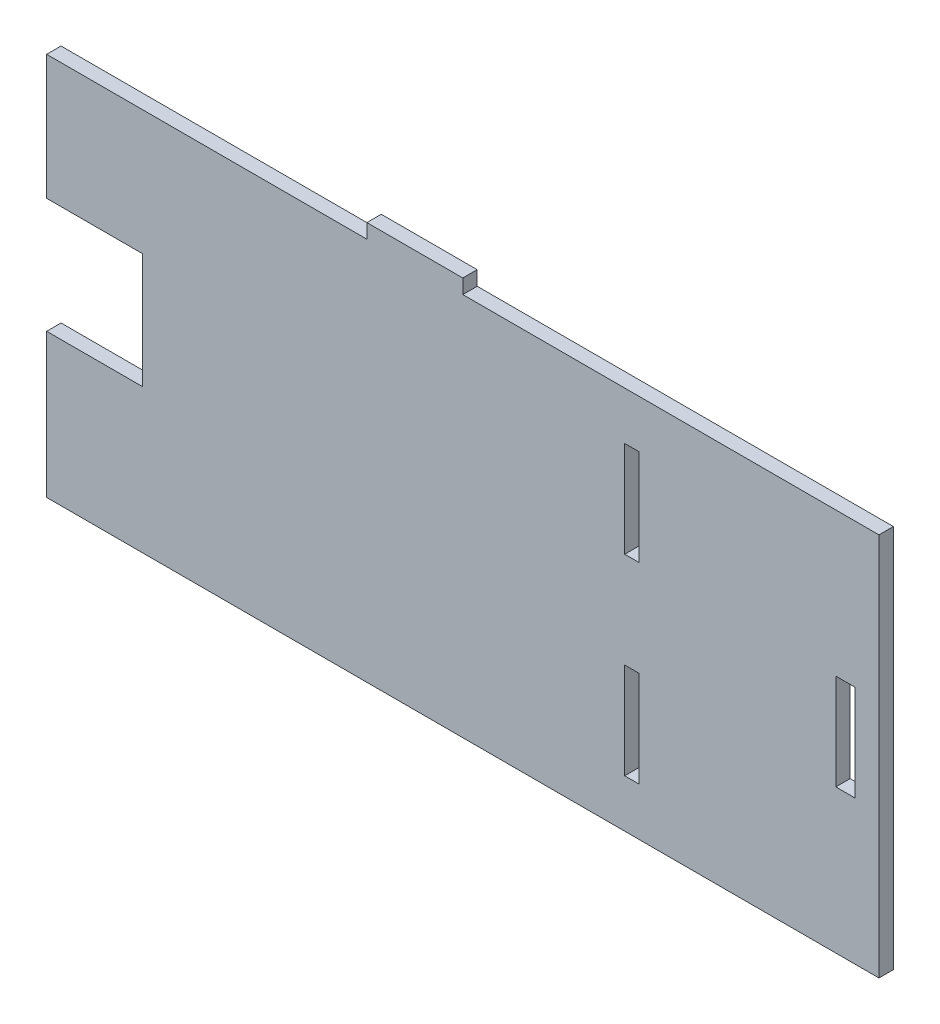
ISO-10303-21;
HEADER;
FILE_DESCRIPTION(('STEP AP214'),'2;1');
FILE_NAME('part.step','',(''),(''),'','','');
FILE_SCHEMA(('AUTOMOTIVE_DESIGN { 1 0 10303 214 1 1 1 1 }'));
ENDSEC;
DATA;
#1=APPLICATION_CONTEXT('core data for automotive mechanical design processes');
#2=APPLICATION_PROTOCOL_DEFINITION('international standard','automotive_design',2000,#1);
#3=PRODUCT_CONTEXT('',#1,'mechanical');
#4=PRODUCT('Part','Part','',(#3));
#5=PRODUCT_RELATED_PRODUCT_CATEGORY('part','',(#4));
#6=PRODUCT_DEFINITION_FORMATION('','',#4);
#7=PRODUCT_DEFINITION_CONTEXT('part definition',#1,'design');
#8=PRODUCT_DEFINITION('design','',#6,#7);
#9=PRODUCT_DEFINITION_SHAPE('','',#8);
#10=(LENGTH_UNIT() NAMED_UNIT(*) SI_UNIT(.MILLI.,.METRE.));
#11=(NAMED_UNIT(*) PLANE_ANGLE_UNIT() SI_UNIT($,.RADIAN.));
#12=(NAMED_UNIT(*) SI_UNIT($,.STERADIAN.) SOLID_ANGLE_UNIT());
#13=UNCERTAINTY_MEASURE_WITH_UNIT(LENGTH_MEASURE(1.E-05),#10,'distance_accuracy_value','');
#14=(GEOMETRIC_REPRESENTATION_CONTEXT(3) GLOBAL_UNCERTAINTY_ASSIGNED_CONTEXT((#13)) GLOBAL_UNIT_ASSIGNED_CONTEXT((#10,
#11,#12)) REPRESENTATION_CONTEXT('',''));
#15=CARTESIAN_POINT('',(0.,0.,0.));
#16=DIRECTION('',(0.,0.,1.));
#17=DIRECTION('',(1.,0.,0.));
#18=AXIS2_PLACEMENT_3D('',#15,#16,#17);
#19=CARTESIAN_POINT('',(-173.5,0.,3.));
#20=DIRECTION('',(1.,0.,0.));
#21=DIRECTION('',(0.,0.,-1.));
#22=AXIS2_PLACEMENT_3D('',#19,#20,#21);
#23=PLANE('',#22);
#24=DIRECTION('',(0.,-1.,0.));
#25=VECTOR('',#24,1.);
#26=CARTESIAN_POINT('',(-173.5,0.,0.));
#27=LINE('',#26,#25);
#28=CARTESIAN_POINT('',(-173.5,0.,0.));
#29=VERTEX_POINT('',#28);
#30=CARTESIAN_POINT('',(-173.5,-26.,0.));
#31=VERTEX_POINT('',#30);
#32=EDGE_CURVE('E241',#29,#31,#27,.T.);
#33=ORIENTED_EDGE('',*,*,#32,.T.);
#34=DIRECTION('',(0.,0.,1.));
#35=VECTOR('',#34,1.);
#36=CARTESIAN_POINT('',(-173.5,-26.,-7.));
#37=LINE('',#36,#35);
#38=CARTESIAN_POINT('',(-173.5,-26.,3.));
#39=VERTEX_POINT('',#38);
#40=EDGE_CURVE('E457',#31,#39,#37,.T.);
#41=ORIENTED_EDGE('',*,*,#40,.T.);
#42=DIRECTION('',(0.,-1.,0.));
#43=VECTOR('',#42,1.);
#44=CARTESIAN_POINT('',(-173.5,0.,3.));
#45=LINE('',#44,#43);
#46=CARTESIAN_POINT('',(-173.5,0.,3.));
#47=VERTEX_POINT('',#46);
#48=EDGE_CURVE('E222',#47,#39,#45,.T.);
#49=ORIENTED_EDGE('',*,*,#48,.F.);
#50=DIRECTION('',(0.,0.,-1.));
#51=VECTOR('',#50,1.);
#52=CARTESIAN_POINT('',(-173.5,0.,3.));
#53=LINE('',#52,#51);
#54=EDGE_CURVE('E250',#47,#29,#53,.T.);
#55=ORIENTED_EDGE('',*,*,#54,.T.);
#56=EDGE_LOOP('',(#33,#41,#49,#55));
#57=FACE_BOUND('',#56,.T.);
#58=ADVANCED_FACE('F39',(#57),#23,.F.);
#59=CARTESIAN_POINT('',(0.,0.,3.));
#60=DIRECTION('',(0.,-1.,0.));
#61=DIRECTION('',(1.,0.,0.));
#62=AXIS2_PLACEMENT_3D('',#59,#60,#61);
#63=PLANE('',#62);
#64=DIRECTION('',(0.,0.,-1.));
#65=VECTOR('',#64,1.);
#66=CARTESIAN_POINT('',(-86.75,0.,3.));
#67=LINE('',#66,#65);
#68=CARTESIAN_POINT('',(-86.75,0.,3.));
#69=VERTEX_POINT('',#68);
#70=CARTESIAN_POINT('',(-86.75,0.,0.));
#71=VERTEX_POINT('',#70);
#72=EDGE_CURVE('E280',#69,#71,#67,.T.);
#73=ORIENTED_EDGE('',*,*,#72,.F.);
#74=DIRECTION('',(-1.,0.,0.));
#75=VECTOR('',#74,1.);
#76=CARTESIAN_POINT('',(0.,0.,3.));
#77=LINE('',#76,#75);
#78=CARTESIAN_POINT('',(0.,0.,3.));
#79=VERTEX_POINT('',#78);
#80=EDGE_CURVE('E223',#79,#69,#77,.T.);
#81=ORIENTED_EDGE('',*,*,#80,.F.);
#82=DIRECTION('',(0.,0.,-1.));
#83=VECTOR('',#82,1.);
#84=CARTESIAN_POINT('',(0.,0.,3.));
#85=LINE('',#84,#83);
#86=CARTESIAN_POINT('',(0.,0.,0.));
#87=VERTEX_POINT('',#86);
#88=EDGE_CURVE('E253',#79,#87,#85,.T.);
#89=ORIENTED_EDGE('',*,*,#88,.T.);
#90=DIRECTION('',(-1.,0.,0.));
#91=VECTOR('',#90,1.);
#92=CARTESIAN_POINT('',(0.,0.,0.));
#93=LINE('',#92,#91);
#94=EDGE_CURVE('E238',#87,#71,#93,.T.);
#95=ORIENTED_EDGE('',*,*,#94,.T.);
#96=EDGE_LOOP('',(#73,#81,#89,#95));
#97=FACE_BOUND('',#96,.T.);
#98=ADVANCED_FACE('F277',(#97),#63,.F.);
#99=DIRECTION('',(0.,0.,1.));
#100=VECTOR('',#99,1.);
#101=CARTESIAN_POINT('',(-106.75,0.,3.));
#102=LINE('',#101,#100);
#103=CARTESIAN_POINT('',(-106.75,0.,0.));
#104=VERTEX_POINT('',#103);
#105=CARTESIAN_POINT('',(-106.75,0.,3.));
#106=VERTEX_POINT('',#105);
#107=EDGE_CURVE('E283',#104,#106,#102,.T.);
#108=ORIENTED_EDGE('',*,*,#107,.F.);
#109=EDGE_CURVE('E236',#104,#29,#93,.T.);
#110=ORIENTED_EDGE('',*,*,#109,.T.);
#111=ORIENTED_EDGE('',*,*,#54,.F.);
#112=EDGE_CURVE('E227',#106,#47,#77,.T.);
#113=ORIENTED_EDGE('',*,*,#112,.F.);
#114=EDGE_LOOP('',(#108,#110,#111,#113));
#115=FACE_BOUND('',#114,.T.);
#116=ADVANCED_FACE('F406',(#115),#63,.F.);
#117=CARTESIAN_POINT('',(0.,0.,3.));
#118=DIRECTION('',(-1.,0.,0.));
#119=DIRECTION('',(0.,0.,1.));
#120=AXIS2_PLACEMENT_3D('',#117,#118,#119);
#121=PLANE('',#120);
#122=DIRECTION('',(0.,1.,0.));
#123=VECTOR('',#122,1.);
#124=CARTESIAN_POINT('',(0.,0.,0.));
#125=LINE('',#124,#123);
#126=CARTESIAN_POINT('',(0.,-80.,0.));
#127=VERTEX_POINT('',#126);
#128=EDGE_CURVE('E233',#127,#87,#125,.T.);
#129=ORIENTED_EDGE('',*,*,#128,.T.);
#130=ORIENTED_EDGE('',*,*,#88,.F.);
#131=DIRECTION('',(0.,1.,0.));
#132=VECTOR('',#131,1.);
#133=CARTESIAN_POINT('',(0.,0.,3.));
#134=LINE('',#133,#132);
#135=CARTESIAN_POINT('',(0.,-80.,3.));
#136=VERTEX_POINT('',#135);
#137=EDGE_CURVE('E246',#136,#79,#134,.T.);
#138=ORIENTED_EDGE('',*,*,#137,.F.);
#139=DIRECTION('',(0.,0.,-1.));
#140=VECTOR('',#139,1.);
#141=CARTESIAN_POINT('',(0.,-80.,3.));
#142=LINE('',#141,#140);
#143=EDGE_CURVE('E232',#136,#127,#142,.T.);
#144=ORIENTED_EDGE('',*,*,#143,.T.);
#145=EDGE_LOOP('',(#129,#130,#138,#144));
#146=FACE_BOUND('',#145,.T.);
#147=ADVANCED_FACE('F41',(#146),#121,.F.);
#148=CARTESIAN_POINT('',(-173.5,-50.,3.));
#149=VERTEX_POINT('',#148);
#150=CARTESIAN_POINT('',(-173.5,-80.,3.));
#151=VERTEX_POINT('',#150);
#152=EDGE_CURVE('E212',#149,#151,#45,.T.);
#153=ORIENTED_EDGE('',*,*,#152,.F.);
#154=DIRECTION('',(0.,0.,1.));
#155=VECTOR('',#154,1.);
#156=CARTESIAN_POINT('',(-173.5,-50.,-7.));
#157=LINE('',#156,#155);
#158=CARTESIAN_POINT('',(-173.5,-50.,0.));
#159=VERTEX_POINT('',#158);
#160=EDGE_CURVE('E197',#159,#149,#157,.T.);
#161=ORIENTED_EDGE('',*,*,#160,.F.);
#162=CARTESIAN_POINT('',(-173.5,-80.,0.));
#163=VERTEX_POINT('',#162);
#164=EDGE_CURVE('E240',#159,#163,#27,.T.);
#165=ORIENTED_EDGE('',*,*,#164,.T.);
#166=DIRECTION('',(0.,0.,-1.));
#167=VECTOR('',#166,1.);
#168=CARTESIAN_POINT('',(-173.5,-80.,3.));
#169=LINE('',#168,#167);
#170=EDGE_CURVE('E220',#151,#163,#169,.T.);
#171=ORIENTED_EDGE('',*,*,#170,.F.);
#172=EDGE_LOOP('',(#153,#161,#165,#171));
#173=FACE_BOUND('',#172,.T.);
#174=ADVANCED_FACE('F218',(#173),#23,.F.);
#175=CARTESIAN_POINT('',(0.,-80.,3.));
#176=DIRECTION('',(0.,1.,0.));
#177=DIRECTION('',(-1.,0.,0.));
#178=AXIS2_PLACEMENT_3D('',#175,#176,#177);
#179=PLANE('',#178);
#180=DIRECTION('',(1.,0.,0.));
#181=VECTOR('',#180,1.);
#182=CARTESIAN_POINT('',(0.,-80.,0.));
#183=LINE('',#182,#181);
#184=EDGE_CURVE('E244',#163,#127,#183,.T.);
#185=ORIENTED_EDGE('',*,*,#184,.T.);
#186=ORIENTED_EDGE('',*,*,#143,.F.);
#187=DIRECTION('',(1.,0.,0.));
#188=VECTOR('',#187,1.);
#189=CARTESIAN_POINT('',(0.,-80.,3.));
#190=LINE('',#189,#188);
#191=EDGE_CURVE('E225',#151,#136,#190,.T.);
#192=ORIENTED_EDGE('',*,*,#191,.F.);
#193=ORIENTED_EDGE('',*,*,#170,.T.);
#194=EDGE_LOOP('',(#185,#186,#192,#193));
#195=FACE_BOUND('',#194,.T.);
#196=ADVANCED_FACE('F268',(#195),#179,.F.);
#197=CARTESIAN_POINT('',(0.,0.,3.));
#198=DIRECTION('',(0.,0.,-1.));
#199=DIRECTION('',(-1.,0.,0.));
#200=AXIS2_PLACEMENT_3D('',#197,#198,#199);
#201=PLANE('',#200);
#202=DIRECTION('',(1.,0.,0.));
#203=VECTOR('',#202,1.);
#204=CARTESIAN_POINT('',(0.,-30.,3.));
#205=LINE('',#204,#203);
#206=CARTESIAN_POINT('',(-9.,-30.,3.));
#207=VERTEX_POINT('',#206);
#208=CARTESIAN_POINT('',(-5.,-30.,3.));
#209=VERTEX_POINT('',#208);
#210=EDGE_CURVE('E290',#207,#209,#205,.T.);
#211=ORIENTED_EDGE('',*,*,#210,.T.);
#212=DIRECTION('',(0.,-1.,0.));
#213=VECTOR('',#212,1.);
#214=CARTESIAN_POINT('',(-5.,0.,3.));
#215=LINE('',#214,#213);
#216=CARTESIAN_POINT('',(-5.,-50.,3.));
#217=VERTEX_POINT('',#216);
#218=EDGE_CURVE('E284',#209,#217,#215,.T.);
#219=ORIENTED_EDGE('',*,*,#218,.T.);
#220=DIRECTION('',(-1.,0.,0.));
#221=VECTOR('',#220,1.);
#222=CARTESIAN_POINT('',(0.,-50.,3.));
#223=LINE('',#222,#221);
#224=CARTESIAN_POINT('',(-9.00000000000001,-50.,3.));
#225=VERTEX_POINT('',#224);
#226=EDGE_CURVE('E437',#217,#225,#223,.T.);
#227=ORIENTED_EDGE('',*,*,#226,.T.);
#228=DIRECTION('',(0.,1.,0.));
#229=VECTOR('',#228,1.);
#230=CARTESIAN_POINT('',(-8.99999999999999,0.,3.));
#231=LINE('',#230,#229);
#232=EDGE_CURVE('E434',#225,#207,#231,.T.);
#233=ORIENTED_EDGE('',*,*,#232,.T.);
#234=EDGE_LOOP('',(#211,#219,#227,#233));
#235=FACE_BOUND('',#234,.T.);
#236=DIRECTION('',(1.,0.,0.));
#237=VECTOR('',#236,1.);
#238=CARTESIAN_POINT('',(-53.,-30.,3.));
#239=LINE('',#238,#237);
#240=CARTESIAN_POINT('',(-53.,-30.,3.));
#241=VERTEX_POINT('',#240);
#242=CARTESIAN_POINT('',(-50.,-30.,3.));
#243=VERTEX_POINT('',#242);
#244=EDGE_CURVE('E319',#241,#243,#239,.T.);
#245=ORIENTED_EDGE('',*,*,#244,.F.);
#246=DIRECTION('',(0.,-1.,0.));
#247=VECTOR('',#246,1.);
#248=CARTESIAN_POINT('',(-53.,-30.,3.));
#249=LINE('',#248,#247);
#250=CARTESIAN_POINT('',(-53.,-10.,3.));
#251=VERTEX_POINT('',#250);
#252=EDGE_CURVE('E317',#251,#241,#249,.T.);
#253=ORIENTED_EDGE('',*,*,#252,.F.);
#254=DIRECTION('',(-1.,0.,0.));
#255=VECTOR('',#254,1.);
#256=CARTESIAN_POINT('',(-53.,-10.,3.));
#257=LINE('',#256,#255);
#258=CARTESIAN_POINT('',(-50.,-10.,3.));
#259=VERTEX_POINT('',#258);
#260=EDGE_CURVE('E325',#259,#251,#257,.T.);
#261=ORIENTED_EDGE('',*,*,#260,.F.);
#262=DIRECTION('',(0.,1.,0.));
#263=VECTOR('',#262,1.);
#264=CARTESIAN_POINT('',(-50.,-30.,3.));
#265=LINE('',#264,#263);
#266=EDGE_CURVE('E322',#243,#259,#265,.T.);
#267=ORIENTED_EDGE('',*,*,#266,.F.);
#268=EDGE_LOOP('',(#245,#253,#261,#267));
#269=FACE_BOUND('',#268,.T.);
#270=DIRECTION('',(1.,0.,0.));
#271=VECTOR('',#270,1.);
#272=CARTESIAN_POINT('',(-53.,-70.,3.));
#273=LINE('',#272,#271);
#274=CARTESIAN_POINT('',(-53.,-70.,3.));
#275=VERTEX_POINT('',#274);
#276=CARTESIAN_POINT('',(-50.,-70.,3.));
#277=VERTEX_POINT('',#276);
#278=EDGE_CURVE('E356',#275,#277,#273,.T.);
#279=ORIENTED_EDGE('',*,*,#278,.F.);
#280=DIRECTION('',(0.,-1.,0.));
#281=VECTOR('',#280,1.);
#282=CARTESIAN_POINT('',(-53.,-70.,3.));
#283=LINE('',#282,#281);
#284=CARTESIAN_POINT('',(-53.,-50.,3.));
#285=VERTEX_POINT('',#284);
#286=EDGE_CURVE('E359',#285,#275,#283,.T.);
#287=ORIENTED_EDGE('',*,*,#286,.F.);
#288=DIRECTION('',(-1.,0.,0.));
#289=VECTOR('',#288,1.);
#290=CARTESIAN_POINT('',(-53.,-50.,3.));
#291=LINE('',#290,#289);
#292=CARTESIAN_POINT('',(-50.,-50.,3.));
#293=VERTEX_POINT('',#292);
#294=EDGE_CURVE('E345',#293,#285,#291,.T.);
#295=ORIENTED_EDGE('',*,*,#294,.F.);
#296=DIRECTION('',(0.,1.,0.));
#297=VECTOR('',#296,1.);
#298=CARTESIAN_POINT('',(-50.,-70.,3.));
#299=LINE('',#298,#297);
#300=EDGE_CURVE('E353',#277,#293,#299,.T.);
#301=ORIENTED_EDGE('',*,*,#300,.F.);
#302=EDGE_LOOP('',(#279,#287,#295,#301));
#303=FACE_BOUND('',#302,.T.);
#304=ORIENTED_EDGE('',*,*,#48,.T.);
#305=DIRECTION('',(-1.,0.,0.));
#306=VECTOR('',#305,1.);
#307=CARTESIAN_POINT('',(-173.5,-26.,3.));
#308=LINE('',#307,#306);
#309=CARTESIAN_POINT('',(-153.5,-26.,3.));
#310=VERTEX_POINT('',#309);
#311=EDGE_CURVE('E207',#310,#39,#308,.T.);
#312=ORIENTED_EDGE('',*,*,#311,.F.);
#313=DIRECTION('',(0.,1.,0.));
#314=VECTOR('',#313,1.);
#315=CARTESIAN_POINT('',(-153.5,-26.,3.));
#316=LINE('',#315,#314);
#317=CARTESIAN_POINT('',(-153.5,-50.,3.));
#318=VERTEX_POINT('',#317);
#319=EDGE_CURVE('E216',#318,#310,#316,.T.);
#320=ORIENTED_EDGE('',*,*,#319,.F.);
#321=DIRECTION('',(1.,0.,0.));
#322=VECTOR('',#321,1.);
#323=CARTESIAN_POINT('',(-173.5,-50.,3.));
#324=LINE('',#323,#322);
#325=EDGE_CURVE('E200',#149,#318,#324,.T.);
#326=ORIENTED_EDGE('',*,*,#325,.F.);
#327=ORIENTED_EDGE('',*,*,#152,.T.);
#328=ORIENTED_EDGE('',*,*,#191,.T.);
#329=ORIENTED_EDGE('',*,*,#137,.T.);
#330=ORIENTED_EDGE('',*,*,#80,.T.);
#331=DIRECTION('',(0.,-1.,0.));
#332=VECTOR('',#331,1.);
#333=CARTESIAN_POINT('',(-86.75,2.99999999999999,3.));
#334=LINE('',#333,#332);
#335=CARTESIAN_POINT('',(-86.75,2.99999999999999,3.));
#336=VERTEX_POINT('',#335);
#337=EDGE_CURVE('E296',#336,#69,#334,.T.);
#338=ORIENTED_EDGE('',*,*,#337,.F.);
#339=DIRECTION('',(1.,0.,0.));
#340=VECTOR('',#339,1.);
#341=CARTESIAN_POINT('',(-86.75,2.99999999999999,3.));
#342=LINE('',#341,#340);
#343=CARTESIAN_POINT('',(-106.75,2.99999999999999,3.));
#344=VERTEX_POINT('',#343);
#345=EDGE_CURVE('E293',#344,#336,#342,.T.);
#346=ORIENTED_EDGE('',*,*,#345,.F.);
#347=DIRECTION('',(0.,-1.,0.));
#348=VECTOR('',#347,1.);
#349=CARTESIAN_POINT('',(-106.75,2.99999999999999,3.));
#350=LINE('',#349,#348);
#351=EDGE_CURVE('E298',#344,#106,#350,.T.);
#352=ORIENTED_EDGE('',*,*,#351,.T.);
#353=ORIENTED_EDGE('',*,*,#112,.T.);
#354=EDGE_LOOP('',(#304,#312,#320,#326,#327,#328,#329,#330,#338,#346,#352,#353));
#355=FACE_BOUND('',#354,.T.);
#356=ADVANCED_FACE('F211',(#235,#269,#303,#355),#201,.F.);
#357=CARTESIAN_POINT('',(0.,0.,0.));
#358=DIRECTION('',(0.,0.,-1.));
#359=DIRECTION('',(-1.,0.,0.));
#360=AXIS2_PLACEMENT_3D('',#357,#358,#359);
#361=PLANE('',#360);
#362=DIRECTION('',(1.,0.,0.));
#363=VECTOR('',#362,1.);
#364=CARTESIAN_POINT('',(0.,-26.,0.));
#365=LINE('',#364,#363);
#366=CARTESIAN_POINT('',(-153.5,-26.,0.));
#367=VERTEX_POINT('',#366);
#368=EDGE_CURVE('E11',#31,#367,#365,.T.);
#369=ORIENTED_EDGE('',*,*,#368,.F.);
#370=ORIENTED_EDGE('',*,*,#32,.F.);
#371=ORIENTED_EDGE('',*,*,#109,.F.);
#372=DIRECTION('',(0.,-1.,0.));
#373=VECTOR('',#372,1.);
#374=CARTESIAN_POINT('',(-106.75,2.99999999999999,0.));
#375=LINE('',#374,#373);
#376=CARTESIAN_POINT('',(-106.75,2.99999999999999,0.));
#377=VERTEX_POINT('',#376);
#378=EDGE_CURVE('E301',#377,#104,#375,.T.);
#379=ORIENTED_EDGE('',*,*,#378,.F.);
#380=DIRECTION('',(-1.,0.,0.));
#381=VECTOR('',#380,1.);
#382=CARTESIAN_POINT('',(-86.75,2.99999999999999,0.));
#383=LINE('',#382,#381);
#384=CARTESIAN_POINT('',(-86.75,2.99999999999999,0.));
#385=VERTEX_POINT('',#384);
#386=EDGE_CURVE('E428',#385,#377,#383,.T.);
#387=ORIENTED_EDGE('',*,*,#386,.F.);
#388=DIRECTION('',(0.,-1.,0.));
#389=VECTOR('',#388,1.);
#390=CARTESIAN_POINT('',(-86.75,2.99999999999999,0.));
#391=LINE('',#390,#389);
#392=EDGE_CURVE('E304',#385,#71,#391,.T.);
#393=ORIENTED_EDGE('',*,*,#392,.T.);
#394=ORIENTED_EDGE('',*,*,#94,.F.);
#395=ORIENTED_EDGE('',*,*,#128,.F.);
#396=ORIENTED_EDGE('',*,*,#184,.F.);
#397=ORIENTED_EDGE('',*,*,#164,.F.);
#398=DIRECTION('',(-1.,0.,0.));
#399=VECTOR('',#398,1.);
#400=CARTESIAN_POINT('',(0.,-50.,0.));
#401=LINE('',#400,#399);
#402=CARTESIAN_POINT('',(-153.5,-50.,0.));
#403=VERTEX_POINT('',#402);
#404=EDGE_CURVE('E203',#403,#159,#401,.T.);
#405=ORIENTED_EDGE('',*,*,#404,.F.);
#406=DIRECTION('',(0.,-1.,0.));
#407=VECTOR('',#406,1.);
#408=CARTESIAN_POINT('',(-153.5,0.,0.));
#409=LINE('',#408,#407);
#410=EDGE_CURVE('E47',#367,#403,#409,.T.);
#411=ORIENTED_EDGE('',*,*,#410,.F.);
#412=EDGE_LOOP('',(#369,#370,#371,#379,#387,#393,#394,#395,#396,#397,#405,#411));
#413=FACE_BOUND('',#412,.T.);
#414=DIRECTION('',(0.,-1.,0.));
#415=VECTOR('',#414,1.);
#416=CARTESIAN_POINT('',(-5.,-30.,0.));
#417=LINE('',#416,#415);
#418=CARTESIAN_POINT('',(-5.,-30.,0.));
#419=VERTEX_POINT('',#418);
#420=CARTESIAN_POINT('',(-5.,-50.,0.));
#421=VERTEX_POINT('',#420);
#422=EDGE_CURVE('E456',#419,#421,#417,.T.);
#423=ORIENTED_EDGE('',*,*,#422,.F.);
#424=DIRECTION('',(1.,0.,0.));
#425=VECTOR('',#424,1.);
#426=CARTESIAN_POINT('',(-5.,-30.,0.));
#427=LINE('',#426,#425);
#428=CARTESIAN_POINT('',(-9.,-30.,0.));
#429=VERTEX_POINT('',#428);
#430=EDGE_CURVE('E444',#429,#419,#427,.T.);
#431=ORIENTED_EDGE('',*,*,#430,.F.);
#432=DIRECTION('',(0.,1.,0.));
#433=VECTOR('',#432,1.);
#434=CARTESIAN_POINT('',(-9.,-30.,0.));
#435=LINE('',#434,#433);
#436=CARTESIAN_POINT('',(-9.00000000000001,-50.,0.));
#437=VERTEX_POINT('',#436);
#438=EDGE_CURVE('E451',#437,#429,#435,.T.);
#439=ORIENTED_EDGE('',*,*,#438,.F.);
#440=DIRECTION('',(-1.,0.,0.));
#441=VECTOR('',#440,1.);
#442=CARTESIAN_POINT('',(-5.,-50.,0.));
#443=LINE('',#442,#441);
#444=EDGE_CURVE('E454',#421,#437,#443,.T.);
#445=ORIENTED_EDGE('',*,*,#444,.F.);
#446=EDGE_LOOP('',(#423,#431,#439,#445));
#447=FACE_BOUND('',#446,.T.);
#448=DIRECTION('',(0.,-1.,0.));
#449=VECTOR('',#448,1.);
#450=CARTESIAN_POINT('',(-53.,-30.,0.));
#451=LINE('',#450,#449);
#452=CARTESIAN_POINT('',(-53.,-10.,0.));
#453=VERTEX_POINT('',#452);
#454=CARTESIAN_POINT('',(-53.,-30.,0.));
#455=VERTEX_POINT('',#454);
#456=EDGE_CURVE('E314',#453,#455,#451,.T.);
#457=ORIENTED_EDGE('',*,*,#456,.T.);
#458=DIRECTION('',(1.,0.,0.));
#459=VECTOR('',#458,1.);
#460=CARTESIAN_POINT('',(-53.,-30.,0.));
#461=LINE('',#460,#459);
#462=CARTESIAN_POINT('',(-50.,-30.,0.));
#463=VERTEX_POINT('',#462);
#464=EDGE_CURVE('E237',#455,#463,#461,.T.);
#465=ORIENTED_EDGE('',*,*,#464,.T.);
#466=DIRECTION('',(0.,1.,0.));
#467=VECTOR('',#466,1.);
#468=CARTESIAN_POINT('',(-50.,-30.,0.));
#469=LINE('',#468,#467);
#470=CARTESIAN_POINT('',(-50.,-10.,0.));
#471=VERTEX_POINT('',#470);
#472=EDGE_CURVE('E307',#463,#471,#469,.T.);
#473=ORIENTED_EDGE('',*,*,#472,.T.);
#474=DIRECTION('',(-1.,0.,0.));
#475=VECTOR('',#474,1.);
#476=CARTESIAN_POINT('',(-53.,-10.,0.));
#477=LINE('',#476,#475);
#478=EDGE_CURVE('E310',#471,#453,#477,.T.);
#479=ORIENTED_EDGE('',*,*,#478,.T.);
#480=EDGE_LOOP('',(#457,#465,#473,#479));
#481=FACE_BOUND('',#480,.T.);
#482=DIRECTION('',(0.,-1.,0.));
#483=VECTOR('',#482,1.);
#484=CARTESIAN_POINT('',(-53.,-70.,0.));
#485=LINE('',#484,#483);
#486=CARTESIAN_POINT('',(-53.,-50.,0.));
#487=VERTEX_POINT('',#486);
#488=CARTESIAN_POINT('',(-53.,-70.,0.));
#489=VERTEX_POINT('',#488);
#490=EDGE_CURVE('E361',#487,#489,#485,.T.);
#491=ORIENTED_EDGE('',*,*,#490,.T.);
#492=DIRECTION('',(1.,0.,0.));
#493=VECTOR('',#492,1.);
#494=CARTESIAN_POINT('',(-53.,-70.,0.));
#495=LINE('',#494,#493);
#496=CARTESIAN_POINT('',(-50.,-70.,0.));
#497=VERTEX_POINT('',#496);
#498=EDGE_CURVE('E306',#489,#497,#495,.T.);
#499=ORIENTED_EDGE('',*,*,#498,.T.);
#500=DIRECTION('',(0.,1.,0.));
#501=VECTOR('',#500,1.);
#502=CARTESIAN_POINT('',(-50.,-70.,0.));
#503=LINE('',#502,#501);
#504=CARTESIAN_POINT('',(-50.,-50.,0.));
#505=VERTEX_POINT('',#504);
#506=EDGE_CURVE('E311',#497,#505,#503,.T.);
#507=ORIENTED_EDGE('',*,*,#506,.T.);
#508=DIRECTION('',(-1.,0.,0.));
#509=VECTOR('',#508,1.);
#510=CARTESIAN_POINT('',(-53.,-50.,0.));
#511=LINE('',#510,#509);
#512=EDGE_CURVE('E364',#505,#487,#511,.T.);
#513=ORIENTED_EDGE('',*,*,#512,.T.);
#514=EDGE_LOOP('',(#491,#499,#507,#513));
#515=FACE_BOUND('',#514,.T.);
#516=ADVANCED_FACE('F263',(#413,#447,#481,#515),#361,.T.);
#517=CARTESIAN_POINT('',(-53.,-70.,-0.00100000000000013));
#518=DIRECTION('',(-1.,0.,0.));
#519=DIRECTION('',(0.,0.,1.));
#520=AXIS2_PLACEMENT_3D('',#517,#518,#519);
#521=PLANE('',#520);
#522=DIRECTION('',(0.,0.,1.));
#523=VECTOR('',#522,1.);
#524=CARTESIAN_POINT('',(-53.,-50.,-0.00100000000000013));
#525=LINE('',#524,#523);
#526=EDGE_CURVE('E341',#487,#285,#525,.T.);
#527=ORIENTED_EDGE('',*,*,#526,.T.);
#528=ORIENTED_EDGE('',*,*,#286,.T.);
#529=DIRECTION('',(0.,0.,1.));
#530=VECTOR('',#529,1.);
#531=CARTESIAN_POINT('',(-53.,-70.,-0.00100000000000013));
#532=LINE('',#531,#530);
#533=EDGE_CURVE('E342',#489,#275,#532,.T.);
#534=ORIENTED_EDGE('',*,*,#533,.F.);
#535=ORIENTED_EDGE('',*,*,#490,.F.);
#536=EDGE_LOOP('',(#527,#528,#534,#535));
#537=FACE_BOUND('',#536,.T.);
#538=ADVANCED_FACE('F380',(#537),#521,.F.);
#539=CARTESIAN_POINT('',(-53.,-50.,-0.00100000000000013));
#540=DIRECTION('',(0.,1.,0.));
#541=DIRECTION('',(0.,0.,1.));
#542=AXIS2_PLACEMENT_3D('',#539,#540,#541);
#543=PLANE('',#542);
#544=DIRECTION('',(0.,0.,1.));
#545=VECTOR('',#544,1.);
#546=CARTESIAN_POINT('',(-50.,-50.,-0.00100000000000013));
#547=LINE('',#546,#545);
#548=EDGE_CURVE('E348',#505,#293,#547,.T.);
#549=ORIENTED_EDGE('',*,*,#548,.T.);
#550=ORIENTED_EDGE('',*,*,#294,.T.);
#551=ORIENTED_EDGE('',*,*,#526,.F.);
#552=ORIENTED_EDGE('',*,*,#512,.F.);
#553=EDGE_LOOP('',(#549,#550,#551,#552));
#554=FACE_BOUND('',#553,.T.);
#555=ADVANCED_FACE('F376',(#554),#543,.F.);
#556=CARTESIAN_POINT('',(-50.,-70.,-0.00100000000000013));
#557=DIRECTION('',(1.,0.,0.));
#558=DIRECTION('',(0.,0.,-1.));
#559=AXIS2_PLACEMENT_3D('',#556,#557,#558);
#560=PLANE('',#559);
#561=DIRECTION('',(0.,0.,1.));
#562=VECTOR('',#561,1.);
#563=CARTESIAN_POINT('',(-50.,-70.,-0.00100000000000013));
#564=LINE('',#563,#562);
#565=EDGE_CURVE('E346',#497,#277,#564,.T.);
#566=ORIENTED_EDGE('',*,*,#565,.T.);
#567=ORIENTED_EDGE('',*,*,#300,.T.);
#568=ORIENTED_EDGE('',*,*,#548,.F.);
#569=ORIENTED_EDGE('',*,*,#506,.F.);
#570=EDGE_LOOP('',(#566,#567,#568,#569));
#571=FACE_BOUND('',#570,.T.);
#572=ADVANCED_FACE('F372',(#571),#560,.F.);
#573=CARTESIAN_POINT('',(-53.,-70.,-0.00100000000000013));
#574=DIRECTION('',(0.,-1.,0.));
#575=DIRECTION('',(0.,0.,-1.));
#576=AXIS2_PLACEMENT_3D('',#573,#574,#575);
#577=PLANE('',#576);
#578=ORIENTED_EDGE('',*,*,#533,.T.);
#579=ORIENTED_EDGE('',*,*,#278,.T.);
#580=ORIENTED_EDGE('',*,*,#565,.F.);
#581=ORIENTED_EDGE('',*,*,#498,.F.);
#582=EDGE_LOOP('',(#578,#579,#580,#581));
#583=FACE_BOUND('',#582,.T.);
#584=ADVANCED_FACE('F384',(#583),#577,.F.);
#585=CARTESIAN_POINT('',(-53.,-30.,-0.00100000000000013));
#586=DIRECTION('',(-1.,0.,0.));
#587=DIRECTION('',(0.,0.,1.));
#588=AXIS2_PLACEMENT_3D('',#585,#586,#587);
#589=PLANE('',#588);
#590=DIRECTION('',(0.,0.,1.));
#591=VECTOR('',#590,1.);
#592=CARTESIAN_POINT('',(-53.,-10.,-0.00100000000000013));
#593=LINE('',#592,#591);
#594=EDGE_CURVE('E329',#453,#251,#593,.T.);
#595=ORIENTED_EDGE('',*,*,#594,.T.);
#596=ORIENTED_EDGE('',*,*,#252,.T.);
#597=DIRECTION('',(0.,0.,1.));
#598=VECTOR('',#597,1.);
#599=CARTESIAN_POINT('',(-53.,-30.,-0.00100000000000013));
#600=LINE('',#599,#598);
#601=EDGE_CURVE('E328',#455,#241,#600,.T.);
#602=ORIENTED_EDGE('',*,*,#601,.F.);
#603=ORIENTED_EDGE('',*,*,#456,.F.);
#604=EDGE_LOOP('',(#595,#596,#602,#603));
#605=FACE_BOUND('',#604,.T.);
#606=ADVANCED_FACE('F502',(#605),#589,.F.);
#607=CARTESIAN_POINT('',(-53.,-10.,-0.00100000000000013));
#608=DIRECTION('',(0.,1.,0.));
#609=DIRECTION('',(0.,0.,1.));
#610=AXIS2_PLACEMENT_3D('',#607,#608,#609);
#611=PLANE('',#610);
#612=DIRECTION('',(0.,0.,1.));
#613=VECTOR('',#612,1.);
#614=CARTESIAN_POINT('',(-50.,-10.,-0.00100000000000013));
#615=LINE('',#614,#613);
#616=EDGE_CURVE('E331',#471,#259,#615,.T.);
#617=ORIENTED_EDGE('',*,*,#616,.T.);
#618=ORIENTED_EDGE('',*,*,#260,.T.);
#619=ORIENTED_EDGE('',*,*,#594,.F.);
#620=ORIENTED_EDGE('',*,*,#478,.F.);
#621=EDGE_LOOP('',(#617,#618,#619,#620));
#622=FACE_BOUND('',#621,.T.);
#623=ADVANCED_FACE('F498',(#622),#611,.F.);
#624=CARTESIAN_POINT('',(-50.,-30.,-0.00100000000000013));
#625=DIRECTION('',(1.,0.,0.));
#626=DIRECTION('',(0.,0.,-1.));
#627=AXIS2_PLACEMENT_3D('',#624,#625,#626);
#628=PLANE('',#627);
#629=DIRECTION('',(0.,0.,1.));
#630=VECTOR('',#629,1.);
#631=CARTESIAN_POINT('',(-50.,-30.,-0.00100000000000013));
#632=LINE('',#631,#630);
#633=EDGE_CURVE('E333',#463,#243,#632,.T.);
#634=ORIENTED_EDGE('',*,*,#633,.T.);
#635=ORIENTED_EDGE('',*,*,#266,.T.);
#636=ORIENTED_EDGE('',*,*,#616,.F.);
#637=ORIENTED_EDGE('',*,*,#472,.F.);
#638=EDGE_LOOP('',(#634,#635,#636,#637));
#639=FACE_BOUND('',#638,.T.);
#640=ADVANCED_FACE('F501',(#639),#628,.F.);
#641=CARTESIAN_POINT('',(-53.,-30.,-0.00100000000000013));
#642=DIRECTION('',(0.,-1.,0.));
#643=DIRECTION('',(0.,0.,-1.));
#644=AXIS2_PLACEMENT_3D('',#641,#642,#643);
#645=PLANE('',#644);
#646=ORIENTED_EDGE('',*,*,#601,.T.);
#647=ORIENTED_EDGE('',*,*,#244,.T.);
#648=ORIENTED_EDGE('',*,*,#633,.F.);
#649=ORIENTED_EDGE('',*,*,#464,.F.);
#650=EDGE_LOOP('',(#646,#647,#648,#649));
#651=FACE_BOUND('',#650,.T.);
#652=ADVANCED_FACE('F497',(#651),#645,.F.);
#653=CARTESIAN_POINT('',(-86.75,2.99999999999999,3.));
#654=DIRECTION('',(-1.,0.,0.));
#655=DIRECTION('',(0.,-1.,0.));
#656=AXIS2_PLACEMENT_3D('',#653,#654,#655);
#657=PLANE('',#656);
#658=ORIENTED_EDGE('',*,*,#72,.T.);
#659=ORIENTED_EDGE('',*,*,#392,.F.);
#660=DIRECTION('',(0.,0.,-1.));
#661=VECTOR('',#660,1.);
#662=CARTESIAN_POINT('',(-86.75,2.99999999999999,3.));
#663=LINE('',#662,#661);
#664=EDGE_CURVE('E287',#336,#385,#663,.T.);
#665=ORIENTED_EDGE('',*,*,#664,.F.);
#666=ORIENTED_EDGE('',*,*,#337,.T.);
#667=EDGE_LOOP('',(#658,#659,#665,#666));
#668=FACE_BOUND('',#667,.T.);
#669=ADVANCED_FACE('F495',(#668),#657,.F.);
#670=CARTESIAN_POINT('',(-106.75,2.99999999999999,3.));
#671=DIRECTION('',(1.,0.,0.));
#672=DIRECTION('',(0.,1.,0.));
#673=AXIS2_PLACEMENT_3D('',#670,#671,#672);
#674=PLANE('',#673);
#675=ORIENTED_EDGE('',*,*,#107,.T.);
#676=ORIENTED_EDGE('',*,*,#351,.F.);
#677=DIRECTION('',(0.,0.,1.));
#678=VECTOR('',#677,1.);
#679=CARTESIAN_POINT('',(-106.75,2.99999999999999,3.));
#680=LINE('',#679,#678);
#681=EDGE_CURVE('E425',#377,#344,#680,.T.);
#682=ORIENTED_EDGE('',*,*,#681,.F.);
#683=ORIENTED_EDGE('',*,*,#378,.T.);
#684=EDGE_LOOP('',(#675,#676,#682,#683));
#685=FACE_BOUND('',#684,.T.);
#686=ADVANCED_FACE('F424',(#685),#674,.F.);
#687=CARTESIAN_POINT('',(0.,3.,0.));
#688=DIRECTION('',(0.,1.,0.));
#689=DIRECTION('',(-1.,0.,0.));
#690=AXIS2_PLACEMENT_3D('',#687,#688,#689);
#691=PLANE('',#690);
#692=ORIENTED_EDGE('',*,*,#664,.T.);
#693=ORIENTED_EDGE('',*,*,#386,.T.);
#694=ORIENTED_EDGE('',*,*,#681,.T.);
#695=ORIENTED_EDGE('',*,*,#345,.T.);
#696=EDGE_LOOP('',(#692,#693,#694,#695));
#697=FACE_BOUND('',#696,.T.);
#698=ADVANCED_FACE('F489',(#697),#691,.T.);
#699=CARTESIAN_POINT('',(-5.,-30.,10.));
#700=DIRECTION('',(1.,0.,0.));
#701=DIRECTION('',(0.,1.,0.));
#702=AXIS2_PLACEMENT_3D('',#699,#700,#701);
#703=PLANE('',#702);
#704=DIRECTION('',(0.,0.,-1.));
#705=VECTOR('',#704,1.);
#706=CARTESIAN_POINT('',(-5.,-30.,10.));
#707=LINE('',#706,#705);
#708=EDGE_CURVE('E440',#209,#419,#707,.T.);
#709=ORIENTED_EDGE('',*,*,#708,.T.);
#710=ORIENTED_EDGE('',*,*,#422,.T.);
#711=DIRECTION('',(0.,0.,-1.));
#712=VECTOR('',#711,1.);
#713=CARTESIAN_POINT('',(-5.,-50.,10.));
#714=LINE('',#713,#712);
#715=EDGE_CURVE('E441',#217,#421,#714,.T.);
#716=ORIENTED_EDGE('',*,*,#715,.F.);
#717=ORIENTED_EDGE('',*,*,#218,.F.);
#718=EDGE_LOOP('',(#709,#710,#716,#717));
#719=FACE_BOUND('',#718,.T.);
#720=ADVANCED_FACE('F482',(#719),#703,.F.);
#721=CARTESIAN_POINT('',(-5.,-30.,10.));
#722=DIRECTION('',(0.,1.,0.));
#723=DIRECTION('',(0.,0.,1.));
#724=AXIS2_PLACEMENT_3D('',#721,#722,#723);
#725=PLANE('',#724);
#726=DIRECTION('',(0.,0.,-1.));
#727=VECTOR('',#726,1.);
#728=CARTESIAN_POINT('',(-9.,-30.,10.));
#729=LINE('',#728,#727);
#730=EDGE_CURVE('E446',#207,#429,#729,.T.);
#731=ORIENTED_EDGE('',*,*,#730,.T.);
#732=ORIENTED_EDGE('',*,*,#430,.T.);
#733=ORIENTED_EDGE('',*,*,#708,.F.);
#734=ORIENTED_EDGE('',*,*,#210,.F.);
#735=EDGE_LOOP('',(#731,#732,#733,#734));
#736=FACE_BOUND('',#735,.T.);
#737=ADVANCED_FACE('F479',(#736),#725,.F.);
#738=CARTESIAN_POINT('',(-9.,-30.,10.));
#739=DIRECTION('',(-1.,0.,0.));
#740=DIRECTION('',(0.,-1.,0.));
#741=AXIS2_PLACEMENT_3D('',#738,#739,#740);
#742=PLANE('',#741);
#743=DIRECTION('',(0.,0.,-1.));
#744=VECTOR('',#743,1.);
#745=CARTESIAN_POINT('',(-9.00000000000001,-50.,10.));
#746=LINE('',#745,#744);
#747=EDGE_CURVE('E62',#225,#437,#746,.T.);
#748=ORIENTED_EDGE('',*,*,#747,.T.);
#749=ORIENTED_EDGE('',*,*,#438,.T.);
#750=ORIENTED_EDGE('',*,*,#730,.F.);
#751=ORIENTED_EDGE('',*,*,#232,.F.);
#752=EDGE_LOOP('',(#748,#749,#750,#751));
#753=FACE_BOUND('',#752,.T.);
#754=ADVANCED_FACE('F474',(#753),#742,.F.);
#755=CARTESIAN_POINT('',(-5.,-50.,10.));
#756=DIRECTION('',(0.,-1.,0.));
#757=DIRECTION('',(0.,0.,-1.));
#758=AXIS2_PLACEMENT_3D('',#755,#756,#757);
#759=PLANE('',#758);
#760=ORIENTED_EDGE('',*,*,#715,.T.);
#761=ORIENTED_EDGE('',*,*,#444,.T.);
#762=ORIENTED_EDGE('',*,*,#747,.F.);
#763=ORIENTED_EDGE('',*,*,#226,.F.);
#764=EDGE_LOOP('',(#760,#761,#762,#763));
#765=FACE_BOUND('',#764,.T.);
#766=ADVANCED_FACE('F468',(#765),#759,.F.);
#767=CARTESIAN_POINT('',(-173.5,-26.,-7.));
#768=DIRECTION('',(0.,1.,0.));
#769=DIRECTION('',(0.,0.,1.));
#770=AXIS2_PLACEMENT_3D('',#767,#768,#769);
#771=PLANE('',#770);
#772=ORIENTED_EDGE('',*,*,#368,.T.);
#773=DIRECTION('',(0.,0.,1.));
#774=VECTOR('',#773,1.);
#775=CARTESIAN_POINT('',(-153.5,-26.,-7.));
#776=LINE('',#775,#774);
#777=EDGE_CURVE('E260',#367,#310,#776,.T.);
#778=ORIENTED_EDGE('',*,*,#777,.T.);
#779=ORIENTED_EDGE('',*,*,#311,.T.);
#780=ORIENTED_EDGE('',*,*,#40,.F.);
#781=EDGE_LOOP('',(#772,#778,#779,#780));
#782=FACE_BOUND('',#781,.T.);
#783=ADVANCED_FACE('F466',(#782),#771,.F.);
#784=CARTESIAN_POINT('',(-153.5,-26.,-7.));
#785=DIRECTION('',(1.,0.,0.));
#786=DIRECTION('',(0.,0.,-1.));
#787=AXIS2_PLACEMENT_3D('',#784,#785,#786);
#788=PLANE('',#787);
#789=ORIENTED_EDGE('',*,*,#410,.T.);
#790=DIRECTION('',(0.,0.,1.));
#791=VECTOR('',#790,1.);
#792=CARTESIAN_POINT('',(-153.5,-50.,-7.));
#793=LINE('',#792,#791);
#794=EDGE_CURVE('E54',#403,#318,#793,.T.);
#795=ORIENTED_EDGE('',*,*,#794,.T.);
#796=ORIENTED_EDGE('',*,*,#319,.T.);
#797=ORIENTED_EDGE('',*,*,#777,.F.);
#798=EDGE_LOOP('',(#789,#795,#796,#797));
#799=FACE_BOUND('',#798,.T.);
#800=ADVANCED_FACE('F259',(#799),#788,.F.);
#801=CARTESIAN_POINT('',(-173.5,-50.,-7.));
#802=DIRECTION('',(0.,-1.,0.));
#803=DIRECTION('',(0.,0.,-1.));
#804=AXIS2_PLACEMENT_3D('',#801,#802,#803);
#805=PLANE('',#804);
#806=ORIENTED_EDGE('',*,*,#404,.T.);
#807=ORIENTED_EDGE('',*,*,#160,.T.);
#808=ORIENTED_EDGE('',*,*,#325,.T.);
#809=ORIENTED_EDGE('',*,*,#794,.F.);
#810=EDGE_LOOP('',(#806,#807,#808,#809));
#811=FACE_BOUND('',#810,.T.);
#812=ADVANCED_FACE('F199',(#811),#805,.F.);
#813=CLOSED_SHELL('',(#58,#98,#116,#147,#174,#196,#356,#516,#538,#555,#572,#584,#606,#623,#640,
#652,#669,#686,#698,#720,#737,#754,#766,#783,#800,#812));
#814=MANIFOLD_SOLID_BREP('B2',#813);
#815=ADVANCED_BREP_SHAPE_REPRESENTATION('',(#18,#814),#14);
#816=SHAPE_DEFINITION_REPRESENTATION(#9,#815);
ENDSEC;
END-ISO-10303-21;
